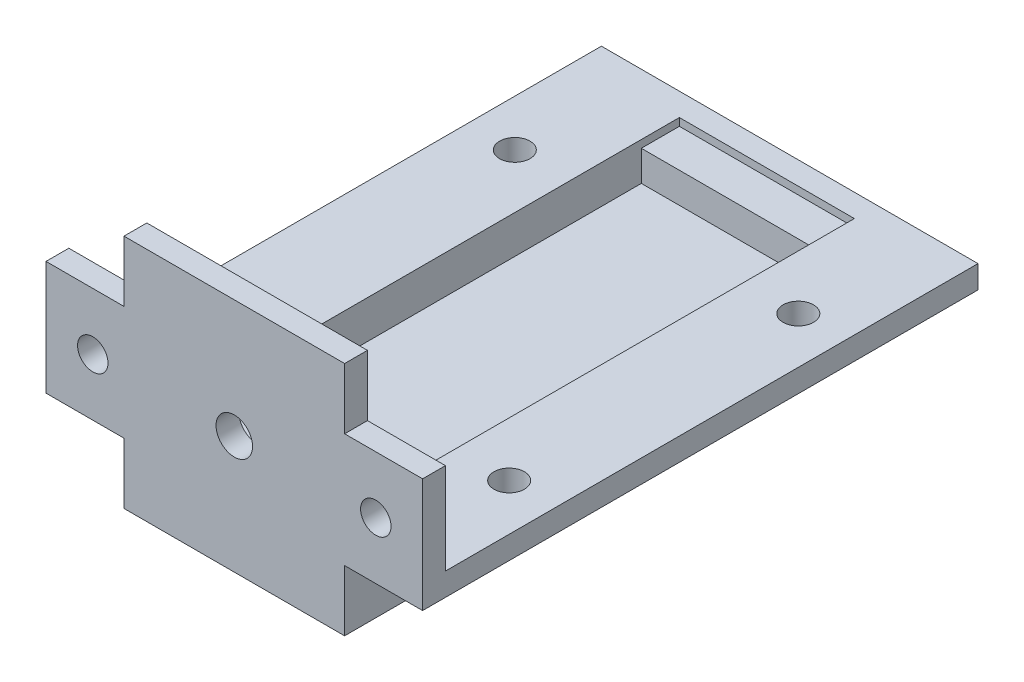
ISO-10303-21;
HEADER;
FILE_DESCRIPTION(('STEP AP214'),'2;1');
FILE_NAME('part.step','',(''),(''),'','','');
FILE_SCHEMA(('AUTOMOTIVE_DESIGN { 1 0 10303 214 1 1 1 1 }'));
ENDSEC;
DATA;
#1=APPLICATION_CONTEXT('core data for automotive mechanical design processes');
#2=APPLICATION_PROTOCOL_DEFINITION('international standard','automotive_design',2000,#1);
#3=PRODUCT_CONTEXT('',#1,'mechanical');
#4=PRODUCT('Part','Part','',(#3));
#5=PRODUCT_RELATED_PRODUCT_CATEGORY('part','',(#4));
#6=PRODUCT_DEFINITION_FORMATION('','',#4);
#7=PRODUCT_DEFINITION_CONTEXT('part definition',#1,'design');
#8=PRODUCT_DEFINITION('design','',#6,#7);
#9=PRODUCT_DEFINITION_SHAPE('','',#8);
#10=(LENGTH_UNIT() NAMED_UNIT(*) SI_UNIT(.MILLI.,.METRE.));
#11=(NAMED_UNIT(*) PLANE_ANGLE_UNIT() SI_UNIT($,.RADIAN.));
#12=(NAMED_UNIT(*) SI_UNIT($,.STERADIAN.) SOLID_ANGLE_UNIT());
#13=UNCERTAINTY_MEASURE_WITH_UNIT(LENGTH_MEASURE(1.E-05),#10,'distance_accuracy_value','');
#14=(GEOMETRIC_REPRESENTATION_CONTEXT(3) GLOBAL_UNCERTAINTY_ASSIGNED_CONTEXT((#13)) GLOBAL_UNIT_ASSIGNED_CONTEXT((#10,
#11,#12)) REPRESENTATION_CONTEXT('',''));
#15=CARTESIAN_POINT('',(0.,0.,0.));
#16=DIRECTION('',(0.,0.,1.));
#17=DIRECTION('',(1.,0.,0.));
#18=AXIS2_PLACEMENT_3D('',#15,#16,#17);
#19=CARTESIAN_POINT('',(-11.5,-9.00000000000001,0.));
#20=DIRECTION('',(-1.,0.,0.));
#21=DIRECTION('',(0.,-1.,0.));
#22=AXIS2_PLACEMENT_3D('',#19,#20,#21);
#23=PLANE('',#22);
#24=DIRECTION('',(0.,-1.,0.));
#25=VECTOR('',#24,1.);
#26=CARTESIAN_POINT('',(-11.5,-5.,-62.));
#27=LINE('',#26,#25);
#28=CARTESIAN_POINT('',(-11.5,-5.,-62.));
#29=VERTEX_POINT('',#28);
#30=CARTESIAN_POINT('',(-11.5,-9.00000000000001,-62.));
#31=VERTEX_POINT('',#30);
#32=EDGE_CURVE('E63',#29,#31,#27,.T.);
#33=ORIENTED_EDGE('',*,*,#32,.F.);
#34=DIRECTION('',(0.,0.,1.));
#35=VECTOR('',#34,1.);
#36=CARTESIAN_POINT('',(-11.5,-5.,-67.));
#37=LINE('',#36,#35);
#38=CARTESIAN_POINT('',(-11.5,-5.,-67.));
#39=VERTEX_POINT('',#38);
#40=EDGE_CURVE('E68',#39,#29,#37,.T.);
#41=ORIENTED_EDGE('',*,*,#40,.F.);
#42=DIRECTION('',(0.,1.,0.));
#43=VECTOR('',#42,1.);
#44=CARTESIAN_POINT('',(-11.5,-9.00000000000001,-67.));
#45=LINE('',#44,#43);
#46=CARTESIAN_POINT('',(-11.5,-4.,-67.));
#47=VERTEX_POINT('',#46);
#48=EDGE_CURVE('E252',#39,#47,#45,.T.);
#49=ORIENTED_EDGE('',*,*,#48,.T.);
#50=DIRECTION('',(0.,0.,1.));
#51=VECTOR('',#50,1.);
#52=CARTESIAN_POINT('',(-11.5,-4.,0.));
#53=LINE('',#52,#51);
#54=CARTESIAN_POINT('',(-11.5,-4.,0.));
#55=VERTEX_POINT('',#54);
#56=EDGE_CURVE('E242',#47,#55,#53,.T.);
#57=ORIENTED_EDGE('',*,*,#56,.T.);
#58=DIRECTION('',(0.,1.,0.));
#59=VECTOR('',#58,1.);
#60=CARTESIAN_POINT('',(-11.5,-9.00000000000001,0.));
#61=LINE('',#60,#59);
#62=CARTESIAN_POINT('',(-11.5,-9.00000000000001,0.));
#63=VERTEX_POINT('',#62);
#64=EDGE_CURVE('E194',#63,#55,#61,.T.);
#65=ORIENTED_EDGE('',*,*,#64,.F.);
#66=DIRECTION('',(0.,0.,1.));
#67=VECTOR('',#66,1.);
#68=CARTESIAN_POINT('',(-11.5,-9.00000000000001,0.));
#69=LINE('',#68,#67);
#70=EDGE_CURVE('E236',#31,#63,#69,.T.);
#71=ORIENTED_EDGE('',*,*,#70,.F.);
#72=EDGE_LOOP('',(#33,#41,#49,#57,#65,#71));
#73=FACE_BOUND('',#72,.T.);
#74=ADVANCED_FACE('F45',(#73),#23,.F.);
#75=CARTESIAN_POINT('',(11.5,-9.00000000000001,0.));
#76=DIRECTION('',(1.,0.,0.));
#77=DIRECTION('',(0.,1.,0.));
#78=AXIS2_PLACEMENT_3D('',#75,#76,#77);
#79=PLANE('',#78);
#80=DIRECTION('',(0.,-1.,0.));
#81=VECTOR('',#80,1.);
#82=CARTESIAN_POINT('',(11.5,-5.,-62.));
#83=LINE('',#82,#81);
#84=CARTESIAN_POINT('',(11.5,-5.,-62.));
#85=VERTEX_POINT('',#84);
#86=CARTESIAN_POINT('',(11.5,-9.00000000000001,-62.));
#87=VERTEX_POINT('',#86);
#88=EDGE_CURVE('E197',#85,#87,#83,.T.);
#89=ORIENTED_EDGE('',*,*,#88,.T.);
#90=DIRECTION('',(0.,0.,-1.));
#91=VECTOR('',#90,1.);
#92=CARTESIAN_POINT('',(11.5,-9.00000000000001,0.));
#93=LINE('',#92,#91);
#94=CARTESIAN_POINT('',(11.5,-9.00000000000001,0.));
#95=VERTEX_POINT('',#94);
#96=EDGE_CURVE('E185',#95,#87,#93,.T.);
#97=ORIENTED_EDGE('',*,*,#96,.F.);
#98=DIRECTION('',(0.,1.,0.));
#99=VECTOR('',#98,1.);
#100=CARTESIAN_POINT('',(11.5,-9.00000000000001,0.));
#101=LINE('',#100,#99);
#102=CARTESIAN_POINT('',(11.5,-4.00000000000001,0.));
#103=VERTEX_POINT('',#102);
#104=EDGE_CURVE('E259',#95,#103,#101,.T.);
#105=ORIENTED_EDGE('',*,*,#104,.T.);
#106=DIRECTION('',(0.,0.,-1.));
#107=VECTOR('',#106,1.);
#108=CARTESIAN_POINT('',(11.5,-4.00000000000001,0.));
#109=LINE('',#108,#107);
#110=CARTESIAN_POINT('',(11.5,-4.00000000000001,-67.));
#111=VERTEX_POINT('',#110);
#112=EDGE_CURVE('E245',#103,#111,#109,.T.);
#113=ORIENTED_EDGE('',*,*,#112,.T.);
#114=DIRECTION('',(0.,1.,0.));
#115=VECTOR('',#114,1.);
#116=CARTESIAN_POINT('',(11.5,-9.00000000000001,-67.));
#117=LINE('',#116,#115);
#118=CARTESIAN_POINT('',(11.5,-5.,-67.));
#119=VERTEX_POINT('',#118);
#120=EDGE_CURVE('E256',#119,#111,#117,.T.);
#121=ORIENTED_EDGE('',*,*,#120,.F.);
#122=DIRECTION('',(0.,0.,-1.));
#123=VECTOR('',#122,1.);
#124=CARTESIAN_POINT('',(11.5,-5.,-67.));
#125=LINE('',#124,#123);
#126=EDGE_CURVE('E201',#85,#119,#125,.T.);
#127=ORIENTED_EDGE('',*,*,#126,.F.);
#128=EDGE_LOOP('',(#89,#97,#105,#113,#121,#127));
#129=FACE_BOUND('',#128,.T.);
#130=ADVANCED_FACE('F198',(#129),#79,.F.);
#131=CARTESIAN_POINT('',(0.,-9.00000000000001,0.));
#132=DIRECTION('',(0.,-1.,0.));
#133=DIRECTION('',(1.,0.,0.));
#134=AXIS2_PLACEMENT_3D('',#131,#132,#133);
#135=PLANE('',#134);
#136=DIRECTION('',(1.,0.,0.));
#137=VECTOR('',#136,1.);
#138=CARTESIAN_POINT('',(-11.5,-9.00000000000001,-62.));
#139=LINE('',#138,#137);
#140=EDGE_CURVE('E189',#31,#87,#139,.T.);
#141=ORIENTED_EDGE('',*,*,#140,.F.);
#142=ORIENTED_EDGE('',*,*,#70,.T.);
#143=DIRECTION('',(1.,0.,0.));
#144=VECTOR('',#143,1.);
#145=CARTESIAN_POINT('',(-11.5,-9.00000000000001,0.));
#146=LINE('',#145,#144);
#147=EDGE_CURVE('E191',#63,#95,#146,.T.);
#148=ORIENTED_EDGE('',*,*,#147,.T.);
#149=ORIENTED_EDGE('',*,*,#96,.T.);
#150=EDGE_LOOP('',(#141,#142,#148,#149));
#151=FACE_BOUND('',#150,.T.);
#152=ADVANCED_FACE('F187',(#151),#135,.F.);
#153=CARTESIAN_POINT('',(-14.5,16.,3.));
#154=DIRECTION('',(1.,0.,0.));
#155=DIRECTION('',(0.,1.,0.));
#156=AXIS2_PLACEMENT_3D('',#153,#154,#155);
#157=PLANE('',#156);
#158=DIRECTION('',(0.,-1.,0.));
#159=VECTOR('',#158,1.);
#160=CARTESIAN_POINT('',(-14.5,16.,0.));
#161=LINE('',#160,#159);
#162=CARTESIAN_POINT('',(-14.5,16.,0.));
#163=VERTEX_POINT('',#162);
#164=CARTESIAN_POINT('',(-14.5,8.,0.));
#165=VERTEX_POINT('',#164);
#166=EDGE_CURVE('E308',#163,#165,#161,.T.);
#167=ORIENTED_EDGE('',*,*,#166,.T.);
#168=DIRECTION('',(0.,0.,-1.));
#169=VECTOR('',#168,1.);
#170=CARTESIAN_POINT('',(-14.5,8.,3.));
#171=LINE('',#170,#169);
#172=CARTESIAN_POINT('',(-14.5,8.,3.));
#173=VERTEX_POINT('',#172);
#174=EDGE_CURVE('E11',#173,#165,#171,.T.);
#175=ORIENTED_EDGE('',*,*,#174,.F.);
#176=DIRECTION('',(0.,-1.,0.));
#177=VECTOR('',#176,1.);
#178=CARTESIAN_POINT('',(-14.5,16.,3.));
#179=LINE('',#178,#177);
#180=CARTESIAN_POINT('',(-14.5,16.,3.));
#181=VERTEX_POINT('',#180);
#182=EDGE_CURVE('E309',#181,#173,#179,.T.);
#183=ORIENTED_EDGE('',*,*,#182,.F.);
#184=DIRECTION('',(0.,0.,-1.));
#185=VECTOR('',#184,1.);
#186=CARTESIAN_POINT('',(-14.5,16.,3.));
#187=LINE('',#186,#185);
#188=EDGE_CURVE('E347',#181,#163,#187,.T.);
#189=ORIENTED_EDGE('',*,*,#188,.T.);
#190=EDGE_LOOP('',(#167,#175,#183,#189));
#191=FACE_BOUND('',#190,.T.);
#192=ADVANCED_FACE('F47',(#191),#157,.F.);
#193=CARTESIAN_POINT('',(-14.5,8.,3.));
#194=DIRECTION('',(0.,-1.,0.));
#195=DIRECTION('',(1.,0.,0.));
#196=AXIS2_PLACEMENT_3D('',#193,#194,#195);
#197=PLANE('',#196);
#198=DIRECTION('',(-1.,0.,0.));
#199=VECTOR('',#198,1.);
#200=CARTESIAN_POINT('',(-14.5,8.,0.));
#201=LINE('',#200,#199);
#202=CARTESIAN_POINT('',(-24.75,7.99999999999999,0.));
#203=VERTEX_POINT('',#202);
#204=EDGE_CURVE('E351',#165,#203,#201,.T.);
#205=ORIENTED_EDGE('',*,*,#204,.T.);
#206=DIRECTION('',(0.,0.,-1.));
#207=VECTOR('',#206,1.);
#208=CARTESIAN_POINT('',(-24.75,7.99999999999999,3.));
#209=LINE('',#208,#207);
#210=CARTESIAN_POINT('',(-24.75,7.99999999999999,3.));
#211=VERTEX_POINT('',#210);
#212=EDGE_CURVE('E55',#211,#203,#209,.T.);
#213=ORIENTED_EDGE('',*,*,#212,.F.);
#214=DIRECTION('',(-1.,0.,0.));
#215=VECTOR('',#214,1.);
#216=CARTESIAN_POINT('',(-14.5,8.,3.));
#217=LINE('',#216,#215);
#218=EDGE_CURVE('E313',#173,#211,#217,.T.);
#219=ORIENTED_EDGE('',*,*,#218,.F.);
#220=ORIENTED_EDGE('',*,*,#174,.T.);
#221=EDGE_LOOP('',(#205,#213,#219,#220));
#222=FACE_BOUND('',#221,.T.);
#223=ADVANCED_FACE('F455',(#222),#197,.F.);
#224=CARTESIAN_POINT('',(-24.75,7.99999999999999,3.));
#225=DIRECTION('',(1.,0.,0.));
#226=DIRECTION('',(0.,1.,0.));
#227=AXIS2_PLACEMENT_3D('',#224,#225,#226);
#228=PLANE('',#227);
#229=DIRECTION('',(0.,-1.,0.));
#230=VECTOR('',#229,1.);
#231=CARTESIAN_POINT('',(-24.75,7.99999999999999,0.));
#232=LINE('',#231,#230);
#233=CARTESIAN_POINT('',(-24.75,-4.,0.));
#234=VERTEX_POINT('',#233);
#235=EDGE_CURVE('E354',#203,#234,#232,.T.);
#236=ORIENTED_EDGE('',*,*,#235,.T.);
#237=DIRECTION('',(0.,0.,1.));
#238=VECTOR('',#237,1.);
#239=CARTESIAN_POINT('',(-24.75,-4.,-70.));
#240=LINE('',#239,#238);
#241=CARTESIAN_POINT('',(-24.75,-4.,-70.));
#242=VERTEX_POINT('',#241);
#243=EDGE_CURVE('E297',#242,#234,#240,.T.);
#244=ORIENTED_EDGE('',*,*,#243,.F.);
#245=DIRECTION('',(0.,1.,0.));
#246=VECTOR('',#245,1.);
#247=CARTESIAN_POINT('',(-24.75,-7.00000000000001,-70.));
#248=LINE('',#247,#246);
#249=CARTESIAN_POINT('',(-24.75,-7.00000000000001,-70.));
#250=VERTEX_POINT('',#249);
#251=EDGE_CURVE('E294',#250,#242,#248,.T.);
#252=ORIENTED_EDGE('',*,*,#251,.F.);
#253=DIRECTION('',(0.,0.,-1.));
#254=VECTOR('',#253,1.);
#255=CARTESIAN_POINT('',(-24.75,-7.,3.));
#256=LINE('',#255,#254);
#257=CARTESIAN_POINT('',(-24.75,-7.,3.));
#258=VERTEX_POINT('',#257);
#259=EDGE_CURVE('E399',#258,#250,#256,.T.);
#260=ORIENTED_EDGE('',*,*,#259,.F.);
#261=DIRECTION('',(0.,-1.,0.));
#262=VECTOR('',#261,1.);
#263=CARTESIAN_POINT('',(-24.75,7.99999999999999,3.));
#264=LINE('',#263,#262);
#265=EDGE_CURVE('E317',#211,#258,#264,.T.);
#266=ORIENTED_EDGE('',*,*,#265,.F.);
#267=ORIENTED_EDGE('',*,*,#212,.T.);
#268=EDGE_LOOP('',(#236,#244,#252,#260,#266,#267));
#269=FACE_BOUND('',#268,.T.);
#270=ADVANCED_FACE('F434',(#269),#228,.F.);
#271=CARTESIAN_POINT('',(-24.75,-7.,3.));
#272=DIRECTION('',(0.,1.,0.));
#273=DIRECTION('',(0.,0.,1.));
#274=AXIS2_PLACEMENT_3D('',#271,#272,#273);
#275=PLANE('',#274);
#276=CARTESIAN_POINT('',(-18.63,-7.,-14.5));
#277=DIRECTION('',(0.,1.,0.));
#278=DIRECTION('',(0.,0.,1.));
#279=AXIS2_PLACEMENT_3D('',#276,#277,#278);
#280=CIRCLE('',#279,2.00000000000001);
#281=CARTESIAN_POINT('',(-18.63,-7.,-12.5));
#282=VERTEX_POINT('',#281);
#283=EDGE_CURVE('E680',#282,#282,#280,.T.);
#284=ORIENTED_EDGE('',*,*,#283,.T.);
#285=EDGE_LOOP('',(#284));
#286=FACE_BOUND('',#285,.T.);
#287=CARTESIAN_POINT('',(-18.63,-7.,-52.5));
#288=DIRECTION('',(0.,1.,0.));
#289=DIRECTION('',(0.,0.,1.));
#290=AXIS2_PLACEMENT_3D('',#287,#288,#289);
#291=CIRCLE('',#290,2.);
#292=CARTESIAN_POINT('',(-18.63,-7.,-50.5));
#293=VERTEX_POINT('',#292);
#294=EDGE_CURVE('E684',#293,#293,#291,.T.);
#295=ORIENTED_EDGE('',*,*,#294,.T.);
#296=EDGE_LOOP('',(#295));
#297=FACE_BOUND('',#296,.T.);
#298=ORIENTED_EDGE('',*,*,#259,.T.);
#299=DIRECTION('',(-1.,0.,0.));
#300=VECTOR('',#299,1.);
#301=CARTESIAN_POINT('',(-14.5,-7.00000000000001,-70.));
#302=LINE('',#301,#300);
#303=CARTESIAN_POINT('',(-14.5,-7.00000000000001,-70.));
#304=VERTEX_POINT('',#303);
#305=EDGE_CURVE('E290',#304,#250,#302,.T.);
#306=ORIENTED_EDGE('',*,*,#305,.F.);
#307=DIRECTION('',(0.,0.,-1.));
#308=VECTOR('',#307,1.);
#309=CARTESIAN_POINT('',(-14.5,-7.,3.));
#310=LINE('',#309,#308);
#311=CARTESIAN_POINT('',(-14.5,-7.,3.));
#312=VERTEX_POINT('',#311);
#313=EDGE_CURVE('E396',#312,#304,#310,.T.);
#314=ORIENTED_EDGE('',*,*,#313,.F.);
#315=DIRECTION('',(1.,0.,0.));
#316=VECTOR('',#315,1.);
#317=CARTESIAN_POINT('',(-24.75,-7.,3.));
#318=LINE('',#317,#316);
#319=EDGE_CURVE('E320',#258,#312,#318,.T.);
#320=ORIENTED_EDGE('',*,*,#319,.F.);
#321=EDGE_LOOP('',(#298,#306,#314,#320));
#322=FACE_BOUND('',#321,.T.);
#323=ADVANCED_FACE('F448',(#286,#297,#322),#275,.F.);
#324=CARTESIAN_POINT('',(-14.5,-7.,3.));
#325=DIRECTION('',(1.,0.,0.));
#326=DIRECTION('',(0.,1.,0.));
#327=AXIS2_PLACEMENT_3D('',#324,#325,#326);
#328=PLANE('',#327);
#329=ORIENTED_EDGE('',*,*,#313,.T.);
#330=DIRECTION('',(0.,1.,0.));
#331=VECTOR('',#330,1.);
#332=CARTESIAN_POINT('',(-14.5,-15.,-70.));
#333=LINE('',#332,#331);
#334=CARTESIAN_POINT('',(-14.5,-15.,-70.));
#335=VERTEX_POINT('',#334);
#336=EDGE_CURVE('E286',#335,#304,#333,.T.);
#337=ORIENTED_EDGE('',*,*,#336,.F.);
#338=DIRECTION('',(0.,0.,-1.));
#339=VECTOR('',#338,1.);
#340=CARTESIAN_POINT('',(-14.5,-15.,3.));
#341=LINE('',#340,#339);
#342=CARTESIAN_POINT('',(-14.5,-15.,3.));
#343=VERTEX_POINT('',#342);
#344=EDGE_CURVE('E393',#343,#335,#341,.T.);
#345=ORIENTED_EDGE('',*,*,#344,.F.);
#346=DIRECTION('',(0.,-1.,0.));
#347=VECTOR('',#346,1.);
#348=CARTESIAN_POINT('',(-14.5,-7.,3.));
#349=LINE('',#348,#347);
#350=EDGE_CURVE('E323',#312,#343,#349,.T.);
#351=ORIENTED_EDGE('',*,*,#350,.F.);
#352=EDGE_LOOP('',(#329,#337,#345,#351));
#353=FACE_BOUND('',#352,.T.);
#354=ADVANCED_FACE('F495',(#353),#328,.F.);
#355=CARTESIAN_POINT('',(-14.5,-15.,3.));
#356=DIRECTION('',(0.,1.,0.));
#357=DIRECTION('',(0.,0.,1.));
#358=AXIS2_PLACEMENT_3D('',#355,#356,#357);
#359=PLANE('',#358);
#360=ORIENTED_EDGE('',*,*,#344,.T.);
#361=DIRECTION('',(-1.,0.,0.));
#362=VECTOR('',#361,1.);
#363=CARTESIAN_POINT('',(14.5,-15.,-70.));
#364=LINE('',#363,#362);
#365=CARTESIAN_POINT('',(14.5,-15.,-70.));
#366=VERTEX_POINT('',#365);
#367=EDGE_CURVE('E282',#366,#335,#364,.T.);
#368=ORIENTED_EDGE('',*,*,#367,.F.);
#369=DIRECTION('',(0.,0.,-1.));
#370=VECTOR('',#369,1.);
#371=CARTESIAN_POINT('',(14.5,-15.,3.));
#372=LINE('',#371,#370);
#373=CARTESIAN_POINT('',(14.5,-15.,3.));
#374=VERTEX_POINT('',#373);
#375=EDGE_CURVE('E390',#374,#366,#372,.T.);
#376=ORIENTED_EDGE('',*,*,#375,.F.);
#377=DIRECTION('',(1.,0.,0.));
#378=VECTOR('',#377,1.);
#379=CARTESIAN_POINT('',(-14.5,-15.,3.));
#380=LINE('',#379,#378);
#381=EDGE_CURVE('E326',#343,#374,#380,.T.);
#382=ORIENTED_EDGE('',*,*,#381,.F.);
#383=EDGE_LOOP('',(#360,#368,#376,#382));
#384=FACE_BOUND('',#383,.T.);
#385=ADVANCED_FACE('F492',(#384),#359,.F.);
#386=CARTESIAN_POINT('',(14.5,-7.00000000000001,3.));
#387=DIRECTION('',(-1.,0.,0.));
#388=DIRECTION('',(0.,0.,1.));
#389=AXIS2_PLACEMENT_3D('',#386,#387,#388);
#390=PLANE('',#389);
#391=ORIENTED_EDGE('',*,*,#375,.T.);
#392=DIRECTION('',(0.,-1.,0.));
#393=VECTOR('',#392,1.);
#394=CARTESIAN_POINT('',(14.5,-7.00000000000001,-70.));
#395=LINE('',#394,#393);
#396=CARTESIAN_POINT('',(14.5,-7.00000000000001,-70.));
#397=VERTEX_POINT('',#396);
#398=EDGE_CURVE('E278',#397,#366,#395,.T.);
#399=ORIENTED_EDGE('',*,*,#398,.F.);
#400=DIRECTION('',(0.,0.,-1.));
#401=VECTOR('',#400,1.);
#402=CARTESIAN_POINT('',(14.5,-7.00000000000001,3.));
#403=LINE('',#402,#401);
#404=CARTESIAN_POINT('',(14.5,-7.00000000000001,3.));
#405=VERTEX_POINT('',#404);
#406=EDGE_CURVE('E387',#405,#397,#403,.T.);
#407=ORIENTED_EDGE('',*,*,#406,.F.);
#408=DIRECTION('',(0.,1.,0.));
#409=VECTOR('',#408,1.);
#410=CARTESIAN_POINT('',(14.5,-7.00000000000001,3.));
#411=LINE('',#410,#409);
#412=EDGE_CURVE('E329',#374,#405,#411,.T.);
#413=ORIENTED_EDGE('',*,*,#412,.F.);
#414=EDGE_LOOP('',(#391,#399,#407,#413));
#415=FACE_BOUND('',#414,.T.);
#416=ADVANCED_FACE('F487',(#415),#390,.F.);
#417=CARTESIAN_POINT('',(24.75,-7.,3.));
#418=DIRECTION('',(0.,1.,0.));
#419=DIRECTION('',(-1.,0.,0.));
#420=AXIS2_PLACEMENT_3D('',#417,#418,#419);
#421=PLANE('',#420);
#422=CARTESIAN_POINT('',(18.63,-7.00000000000001,-52.5));
#423=DIRECTION('',(0.,1.,0.));
#424=DIRECTION('',(-1.,0.,0.));
#425=AXIS2_PLACEMENT_3D('',#422,#423,#424);
#426=CIRCLE('',#425,2.);
#427=CARTESIAN_POINT('',(16.63,-7.00000000000001,-52.5));
#428=VERTEX_POINT('',#427);
#429=EDGE_CURVE('E209',#428,#428,#426,.T.);
#430=ORIENTED_EDGE('',*,*,#429,.T.);
#431=EDGE_LOOP('',(#430));
#432=FACE_BOUND('',#431,.T.);
#433=CARTESIAN_POINT('',(18.63,-7.00000000000001,-14.5));
#434=DIRECTION('',(0.,1.,0.));
#435=DIRECTION('',(-1.,0.,0.));
#436=AXIS2_PLACEMENT_3D('',#433,#434,#435);
#437=CIRCLE('',#436,2.00000000000001);
#438=CARTESIAN_POINT('',(16.63,-7.00000000000001,-14.5));
#439=VERTEX_POINT('',#438);
#440=EDGE_CURVE('E216',#439,#439,#437,.T.);
#441=ORIENTED_EDGE('',*,*,#440,.T.);
#442=EDGE_LOOP('',(#441));
#443=FACE_BOUND('',#442,.T.);
#444=ORIENTED_EDGE('',*,*,#406,.T.);
#445=DIRECTION('',(-1.,0.,0.));
#446=VECTOR('',#445,1.);
#447=CARTESIAN_POINT('',(24.75,-7.00000000000001,-70.));
#448=LINE('',#447,#446);
#449=CARTESIAN_POINT('',(24.75,-7.00000000000001,-70.));
#450=VERTEX_POINT('',#449);
#451=EDGE_CURVE('E274',#450,#397,#448,.T.);
#452=ORIENTED_EDGE('',*,*,#451,.F.);
#453=DIRECTION('',(0.,0.,-1.));
#454=VECTOR('',#453,1.);
#455=CARTESIAN_POINT('',(24.75,-7.,3.));
#456=LINE('',#455,#454);
#457=CARTESIAN_POINT('',(24.75,-7.,3.));
#458=VERTEX_POINT('',#457);
#459=EDGE_CURVE('E384',#458,#450,#456,.T.);
#460=ORIENTED_EDGE('',*,*,#459,.F.);
#461=DIRECTION('',(1.,0.,0.));
#462=VECTOR('',#461,1.);
#463=CARTESIAN_POINT('',(24.75,-7.,3.));
#464=LINE('',#463,#462);
#465=EDGE_CURVE('E332',#405,#458,#464,.T.);
#466=ORIENTED_EDGE('',*,*,#465,.F.);
#467=EDGE_LOOP('',(#444,#452,#460,#466));
#468=FACE_BOUND('',#467,.T.);
#469=ADVANCED_FACE('F482',(#432,#443,#468),#421,.F.);
#470=CARTESIAN_POINT('',(24.75,8.,3.));
#471=DIRECTION('',(-1.,0.,0.));
#472=DIRECTION('',(0.,-1.,0.));
#473=AXIS2_PLACEMENT_3D('',#470,#471,#472);
#474=PLANE('',#473);
#475=ORIENTED_EDGE('',*,*,#459,.T.);
#476=DIRECTION('',(0.,-1.,0.));
#477=VECTOR('',#476,1.);
#478=CARTESIAN_POINT('',(24.75,-4.00000000000001,-70.));
#479=LINE('',#478,#477);
#480=CARTESIAN_POINT('',(24.75,-4.00000000000001,-70.));
#481=VERTEX_POINT('',#480);
#482=EDGE_CURVE('E269',#481,#450,#479,.T.);
#483=ORIENTED_EDGE('',*,*,#482,.F.);
#484=DIRECTION('',(0.,0.,1.));
#485=VECTOR('',#484,1.);
#486=CARTESIAN_POINT('',(24.75,-4.00000000000001,-70.));
#487=LINE('',#486,#485);
#488=CARTESIAN_POINT('',(24.75,-4.00000000000001,0.));
#489=VERTEX_POINT('',#488);
#490=EDGE_CURVE('E304',#481,#489,#487,.T.);
#491=ORIENTED_EDGE('',*,*,#490,.T.);
#492=DIRECTION('',(0.,1.,0.));
#493=VECTOR('',#492,1.);
#494=CARTESIAN_POINT('',(24.75,8.,0.));
#495=LINE('',#494,#493);
#496=CARTESIAN_POINT('',(24.75,8.,0.));
#497=VERTEX_POINT('',#496);
#498=EDGE_CURVE('E358',#489,#497,#495,.T.);
#499=ORIENTED_EDGE('',*,*,#498,.T.);
#500=DIRECTION('',(0.,0.,-1.));
#501=VECTOR('',#500,1.);
#502=CARTESIAN_POINT('',(24.75,8.,3.));
#503=LINE('',#502,#501);
#504=CARTESIAN_POINT('',(24.75,8.,3.));
#505=VERTEX_POINT('',#504);
#506=EDGE_CURVE('E380',#505,#497,#503,.T.);
#507=ORIENTED_EDGE('',*,*,#506,.F.);
#508=DIRECTION('',(0.,1.,0.));
#509=VECTOR('',#508,1.);
#510=CARTESIAN_POINT('',(24.75,8.,3.));
#511=LINE('',#510,#509);
#512=EDGE_CURVE('E335',#458,#505,#511,.T.);
#513=ORIENTED_EDGE('',*,*,#512,.F.);
#514=EDGE_LOOP('',(#475,#483,#491,#499,#507,#513));
#515=FACE_BOUND('',#514,.T.);
#516=ADVANCED_FACE('F478',(#515),#474,.F.);
#517=CARTESIAN_POINT('',(14.5,8.,3.));
#518=DIRECTION('',(0.,-1.,0.));
#519=DIRECTION('',(1.,0.,0.));
#520=AXIS2_PLACEMENT_3D('',#517,#518,#519);
#521=PLANE('',#520);
#522=DIRECTION('',(-1.,0.,0.));
#523=VECTOR('',#522,1.);
#524=CARTESIAN_POINT('',(14.5,8.,0.));
#525=LINE('',#524,#523);
#526=CARTESIAN_POINT('',(14.5,8.,0.));
#527=VERTEX_POINT('',#526);
#528=EDGE_CURVE('E361',#497,#527,#525,.T.);
#529=ORIENTED_EDGE('',*,*,#528,.T.);
#530=DIRECTION('',(0.,0.,-1.));
#531=VECTOR('',#530,1.);
#532=CARTESIAN_POINT('',(14.5,8.,3.));
#533=LINE('',#532,#531);
#534=CARTESIAN_POINT('',(14.5,8.,3.));
#535=VERTEX_POINT('',#534);
#536=EDGE_CURVE('E376',#535,#527,#533,.T.);
#537=ORIENTED_EDGE('',*,*,#536,.F.);
#538=DIRECTION('',(-1.,0.,0.));
#539=VECTOR('',#538,1.);
#540=CARTESIAN_POINT('',(14.5,8.,3.));
#541=LINE('',#540,#539);
#542=EDGE_CURVE('E338',#505,#535,#541,.T.);
#543=ORIENTED_EDGE('',*,*,#542,.F.);
#544=ORIENTED_EDGE('',*,*,#506,.T.);
#545=EDGE_LOOP('',(#529,#537,#543,#544));
#546=FACE_BOUND('',#545,.T.);
#547=ADVANCED_FACE('F473',(#546),#521,.F.);
#548=CARTESIAN_POINT('',(14.5,16.,3.));
#549=DIRECTION('',(-1.,0.,0.));
#550=DIRECTION('',(0.,-1.,0.));
#551=AXIS2_PLACEMENT_3D('',#548,#549,#550);
#552=PLANE('',#551);
#553=DIRECTION('',(0.,1.,0.));
#554=VECTOR('',#553,1.);
#555=CARTESIAN_POINT('',(14.5,16.,0.));
#556=LINE('',#555,#554);
#557=CARTESIAN_POINT('',(14.5,16.,0.));
#558=VERTEX_POINT('',#557);
#559=EDGE_CURVE('E364',#527,#558,#556,.T.);
#560=ORIENTED_EDGE('',*,*,#559,.T.);
#561=DIRECTION('',(0.,0.,-1.));
#562=VECTOR('',#561,1.);
#563=CARTESIAN_POINT('',(14.5,16.,3.));
#564=LINE('',#563,#562);
#565=CARTESIAN_POINT('',(14.5,16.,3.));
#566=VERTEX_POINT('',#565);
#567=EDGE_CURVE('E372',#566,#558,#564,.T.);
#568=ORIENTED_EDGE('',*,*,#567,.F.);
#569=DIRECTION('',(0.,1.,0.));
#570=VECTOR('',#569,1.);
#571=CARTESIAN_POINT('',(14.5,16.,3.));
#572=LINE('',#571,#570);
#573=EDGE_CURVE('E341',#535,#566,#572,.T.);
#574=ORIENTED_EDGE('',*,*,#573,.F.);
#575=ORIENTED_EDGE('',*,*,#536,.T.);
#576=EDGE_LOOP('',(#560,#568,#574,#575));
#577=FACE_BOUND('',#576,.T.);
#578=ADVANCED_FACE('F467',(#577),#552,.F.);
#579=CARTESIAN_POINT('',(14.5,16.,3.));
#580=DIRECTION('',(0.,-1.,0.));
#581=DIRECTION('',(1.,0.,0.));
#582=AXIS2_PLACEMENT_3D('',#579,#580,#581);
#583=PLANE('',#582);
#584=DIRECTION('',(-1.,0.,0.));
#585=VECTOR('',#584,1.);
#586=CARTESIAN_POINT('',(14.5,16.,0.));
#587=LINE('',#586,#585);
#588=EDGE_CURVE('E314',#558,#163,#587,.T.);
#589=ORIENTED_EDGE('',*,*,#588,.T.);
#590=ORIENTED_EDGE('',*,*,#188,.F.);
#591=DIRECTION('',(-1.,0.,0.));
#592=VECTOR('',#591,1.);
#593=CARTESIAN_POINT('',(14.5,16.,3.));
#594=LINE('',#593,#592);
#595=EDGE_CURVE('E344',#566,#181,#594,.T.);
#596=ORIENTED_EDGE('',*,*,#595,.F.);
#597=ORIENTED_EDGE('',*,*,#567,.T.);
#598=EDGE_LOOP('',(#589,#590,#596,#597));
#599=FACE_BOUND('',#598,.T.);
#600=ADVANCED_FACE('F463',(#599),#583,.F.);
#601=CARTESIAN_POINT('',(0.,0.,3.));
#602=DIRECTION('',(0.,0.,-1.));
#603=DIRECTION('',(-1.,0.,0.));
#604=AXIS2_PLACEMENT_3D('',#601,#602,#603);
#605=PLANE('',#604);
#606=CARTESIAN_POINT('',(18.6,0.499999999999997,3.));
#607=DIRECTION('',(0.,0.,1.));
#608=DIRECTION('',(-1.,0.,0.));
#609=AXIS2_PLACEMENT_3D('',#606,#607,#608);
#610=CIRCLE('',#609,2.);
#611=CARTESIAN_POINT('',(16.6,0.499999999999997,3.));
#612=VERTEX_POINT('',#611);
#613=EDGE_CURVE('E223',#612,#612,#610,.T.);
#614=ORIENTED_EDGE('',*,*,#613,.F.);
#615=EDGE_LOOP('',(#614));
#616=FACE_BOUND('',#615,.T.);
#617=CARTESIAN_POINT('',(-18.6,0.499999999999997,3.));
#618=DIRECTION('',(0.,0.,1.));
#619=DIRECTION('',(1.,0.,0.));
#620=AXIS2_PLACEMENT_3D('',#617,#618,#619);
#621=CIRCLE('',#620,2.);
#622=CARTESIAN_POINT('',(-16.6,0.499999999999997,3.));
#623=VERTEX_POINT('',#622);
#624=EDGE_CURVE('E224',#623,#623,#621,.T.);
#625=ORIENTED_EDGE('',*,*,#624,.F.);
#626=EDGE_LOOP('',(#625));
#627=FACE_BOUND('',#626,.T.);
#628=CARTESIAN_POINT('',(0.,0.499999999999997,3.));
#629=DIRECTION('',(0.,0.,1.));
#630=DIRECTION('',(1.,0.,0.));
#631=AXIS2_PLACEMENT_3D('',#628,#629,#630);
#632=CIRCLE('',#631,2.4);
#633=CARTESIAN_POINT('',(2.4,0.499999999999997,3.));
#634=VERTEX_POINT('',#633);
#635=EDGE_CURVE('E228',#634,#634,#632,.T.);
#636=ORIENTED_EDGE('',*,*,#635,.F.);
#637=EDGE_LOOP('',(#636));
#638=FACE_BOUND('',#637,.T.);
#639=ORIENTED_EDGE('',*,*,#182,.T.);
#640=ORIENTED_EDGE('',*,*,#218,.T.);
#641=ORIENTED_EDGE('',*,*,#265,.T.);
#642=ORIENTED_EDGE('',*,*,#319,.T.);
#643=ORIENTED_EDGE('',*,*,#350,.T.);
#644=ORIENTED_EDGE('',*,*,#381,.T.);
#645=ORIENTED_EDGE('',*,*,#412,.T.);
#646=ORIENTED_EDGE('',*,*,#465,.T.);
#647=ORIENTED_EDGE('',*,*,#512,.T.);
#648=ORIENTED_EDGE('',*,*,#542,.T.);
#649=ORIENTED_EDGE('',*,*,#573,.T.);
#650=ORIENTED_EDGE('',*,*,#595,.T.);
#651=EDGE_LOOP('',(#639,#640,#641,#642,#643,#644,#645,#646,#647,#648,#649,#650));
#652=FACE_BOUND('',#651,.T.);
#653=ADVANCED_FACE('F423',(#616,#627,#638,#652),#605,.F.);
#654=CARTESIAN_POINT('',(0.,0.,0.));
#655=DIRECTION('',(0.,0.,-1.));
#656=DIRECTION('',(-1.,0.,0.));
#657=AXIS2_PLACEMENT_3D('',#654,#655,#656);
#658=PLANE('',#657);
#659=CARTESIAN_POINT('',(18.6,0.499999999999997,0.));
#660=DIRECTION('',(0.,0.,-1.));
#661=DIRECTION('',(-1.,0.,0.));
#662=AXIS2_PLACEMENT_3D('',#659,#660,#661);
#663=CIRCLE('',#662,2.);
#664=CARTESIAN_POINT('',(16.6,0.499999999999997,0.));
#665=VERTEX_POINT('',#664);
#666=EDGE_CURVE('E49',#665,#665,#663,.T.);
#667=ORIENTED_EDGE('',*,*,#666,.F.);
#668=EDGE_LOOP('',(#667));
#669=FACE_BOUND('',#668,.T.);
#670=CARTESIAN_POINT('',(-18.6,0.499999999999997,0.));
#671=DIRECTION('',(0.,0.,-1.));
#672=DIRECTION('',(-1.,0.,0.));
#673=AXIS2_PLACEMENT_3D('',#670,#671,#672);
#674=CIRCLE('',#673,2.);
#675=CARTESIAN_POINT('',(-20.6,0.499999999999997,0.));
#676=VERTEX_POINT('',#675);
#677=EDGE_CURVE('E407',#676,#676,#674,.T.);
#678=ORIENTED_EDGE('',*,*,#677,.F.);
#679=EDGE_LOOP('',(#678));
#680=FACE_BOUND('',#679,.T.);
#681=CARTESIAN_POINT('',(0.,0.499999999999997,0.));
#682=DIRECTION('',(0.,0.,-1.));
#683=DIRECTION('',(-1.,0.,0.));
#684=AXIS2_PLACEMENT_3D('',#681,#682,#683);
#685=CIRCLE('',#684,2.4);
#686=CARTESIAN_POINT('',(-2.4,0.499999999999997,0.));
#687=VERTEX_POINT('',#686);
#688=EDGE_CURVE('E235',#687,#687,#685,.T.);
#689=ORIENTED_EDGE('',*,*,#688,.F.);
#690=EDGE_LOOP('',(#689));
#691=FACE_BOUND('',#690,.T.);
#692=DIRECTION('',(1.,0.,0.));
#693=VECTOR('',#692,1.);
#694=CARTESIAN_POINT('',(-24.75,-4.,0.));
#695=LINE('',#694,#693);
#696=EDGE_CURVE('E270',#234,#55,#695,.T.);
#697=ORIENTED_EDGE('',*,*,#696,.F.);
#698=ORIENTED_EDGE('',*,*,#235,.F.);
#699=ORIENTED_EDGE('',*,*,#204,.F.);
#700=ORIENTED_EDGE('',*,*,#166,.F.);
#701=ORIENTED_EDGE('',*,*,#588,.F.);
#702=ORIENTED_EDGE('',*,*,#559,.F.);
#703=ORIENTED_EDGE('',*,*,#528,.F.);
#704=ORIENTED_EDGE('',*,*,#498,.F.);
#705=EDGE_CURVE('E255',#103,#489,#695,.T.);
#706=ORIENTED_EDGE('',*,*,#705,.F.);
#707=ORIENTED_EDGE('',*,*,#104,.F.);
#708=ORIENTED_EDGE('',*,*,#147,.F.);
#709=ORIENTED_EDGE('',*,*,#64,.T.);
#710=EDGE_LOOP('',(#697,#698,#699,#700,#701,#702,#703,#704,#706,#707,#708,#709));
#711=FACE_BOUND('',#710,.T.);
#712=ADVANCED_FACE('F419',(#669,#680,#691,#711),#658,.T.);
#713=CARTESIAN_POINT('',(-24.75,-4.,-70.));
#714=DIRECTION('',(0.,-1.,0.));
#715=DIRECTION('',(1.,0.,0.));
#716=AXIS2_PLACEMENT_3D('',#713,#714,#715);
#717=PLANE('',#716);
#718=CARTESIAN_POINT('',(18.63,-4.00000000000001,-52.5));
#719=DIRECTION('',(0.,1.,0.));
#720=DIRECTION('',(1.,0.,0.));
#721=AXIS2_PLACEMENT_3D('',#718,#719,#720);
#722=CIRCLE('',#721,2.);
#723=CARTESIAN_POINT('',(20.63,-4.00000000000001,-52.5));
#724=VERTEX_POINT('',#723);
#725=EDGE_CURVE('E693',#724,#724,#722,.T.);
#726=ORIENTED_EDGE('',*,*,#725,.F.);
#727=EDGE_LOOP('',(#726));
#728=FACE_BOUND('',#727,.T.);
#729=CARTESIAN_POINT('',(18.63,-4.00000000000001,-14.5));
#730=DIRECTION('',(0.,1.,0.));
#731=DIRECTION('',(-1.,0.,0.));
#732=AXIS2_PLACEMENT_3D('',#729,#730,#731);
#733=CIRCLE('',#732,2.00000000000001);
#734=CARTESIAN_POINT('',(16.63,-4.00000000000001,-14.5));
#735=VERTEX_POINT('',#734);
#736=EDGE_CURVE('E696',#735,#735,#733,.T.);
#737=ORIENTED_EDGE('',*,*,#736,.F.);
#738=EDGE_LOOP('',(#737));
#739=FACE_BOUND('',#738,.T.);
#740=CARTESIAN_POINT('',(-18.63,-4.,-14.5));
#741=DIRECTION('',(0.,1.,0.));
#742=DIRECTION('',(1.,0.,0.));
#743=AXIS2_PLACEMENT_3D('',#740,#741,#742);
#744=CIRCLE('',#743,2.00000000000001);
#745=CARTESIAN_POINT('',(-16.63,-4.,-14.5));
#746=VERTEX_POINT('',#745);
#747=EDGE_CURVE('E692',#746,#746,#744,.T.);
#748=ORIENTED_EDGE('',*,*,#747,.F.);
#749=EDGE_LOOP('',(#748));
#750=FACE_BOUND('',#749,.T.);
#751=CARTESIAN_POINT('',(-18.63,-4.,-52.5));
#752=DIRECTION('',(0.,1.,0.));
#753=DIRECTION('',(-1.,0.,0.));
#754=AXIS2_PLACEMENT_3D('',#751,#752,#753);
#755=CIRCLE('',#754,2.);
#756=CARTESIAN_POINT('',(-20.63,-4.,-52.5));
#757=VERTEX_POINT('',#756);
#758=EDGE_CURVE('E688',#757,#757,#755,.T.);
#759=ORIENTED_EDGE('',*,*,#758,.F.);
#760=EDGE_LOOP('',(#759));
#761=FACE_BOUND('',#760,.T.);
#762=ORIENTED_EDGE('',*,*,#696,.T.);
#763=ORIENTED_EDGE('',*,*,#56,.F.);
#764=DIRECTION('',(-1.,0.,0.));
#765=VECTOR('',#764,1.);
#766=CARTESIAN_POINT('',(-11.5,-4.,-67.));
#767=LINE('',#766,#765);
#768=EDGE_CURVE('E239',#111,#47,#767,.T.);
#769=ORIENTED_EDGE('',*,*,#768,.F.);
#770=ORIENTED_EDGE('',*,*,#112,.F.);
#771=ORIENTED_EDGE('',*,*,#705,.T.);
#772=ORIENTED_EDGE('',*,*,#490,.F.);
#773=DIRECTION('',(1.,0.,0.));
#774=VECTOR('',#773,1.);
#775=CARTESIAN_POINT('',(-24.75,-4.,-70.));
#776=LINE('',#775,#774);
#777=EDGE_CURVE('E265',#242,#481,#776,.T.);
#778=ORIENTED_EDGE('',*,*,#777,.F.);
#779=ORIENTED_EDGE('',*,*,#243,.T.);
#780=EDGE_LOOP('',(#762,#763,#769,#770,#771,#772,#778,#779));
#781=FACE_BOUND('',#780,.T.);
#782=ADVANCED_FACE('F422',(#728,#739,#750,#761,#781),#717,.F.);
#783=CARTESIAN_POINT('',(0.,0.,-70.));
#784=DIRECTION('',(0.,0.,-1.));
#785=DIRECTION('',(-1.,0.,0.));
#786=AXIS2_PLACEMENT_3D('',#783,#784,#785);
#787=PLANE('',#786);
#788=ORIENTED_EDGE('',*,*,#777,.T.);
#789=ORIENTED_EDGE('',*,*,#482,.T.);
#790=ORIENTED_EDGE('',*,*,#451,.T.);
#791=ORIENTED_EDGE('',*,*,#398,.T.);
#792=ORIENTED_EDGE('',*,*,#367,.T.);
#793=ORIENTED_EDGE('',*,*,#336,.T.);
#794=ORIENTED_EDGE('',*,*,#305,.T.);
#795=ORIENTED_EDGE('',*,*,#251,.T.);
#796=EDGE_LOOP('',(#788,#789,#790,#791,#792,#793,#794,#795));
#797=FACE_BOUND('',#796,.T.);
#798=ADVANCED_FACE('F441',(#797),#787,.T.);
#799=CARTESIAN_POINT('',(-11.5,-9.00000000000001,-67.));
#800=DIRECTION('',(0.,0.,-1.));
#801=DIRECTION('',(-1.,0.,0.));
#802=AXIS2_PLACEMENT_3D('',#799,#800,#801);
#803=PLANE('',#802);
#804=ORIENTED_EDGE('',*,*,#48,.F.);
#805=DIRECTION('',(-1.,0.,0.));
#806=VECTOR('',#805,1.);
#807=CARTESIAN_POINT('',(-11.5,-5.,-67.));
#808=LINE('',#807,#806);
#809=EDGE_CURVE('E205',#119,#39,#808,.T.);
#810=ORIENTED_EDGE('',*,*,#809,.F.);
#811=ORIENTED_EDGE('',*,*,#120,.T.);
#812=ORIENTED_EDGE('',*,*,#768,.T.);
#813=EDGE_LOOP('',(#804,#810,#811,#812));
#814=FACE_BOUND('',#813,.T.);
#815=ADVANCED_FACE('F517',(#814),#803,.F.);
#816=CARTESIAN_POINT('',(0.,0.499999999999997,-2.));
#817=DIRECTION('',(0.,0.,1.));
#818=DIRECTION('',(1.,0.,0.));
#819=AXIS2_PLACEMENT_3D('',#816,#817,#818);
#820=CYLINDRICAL_SURFACE('',#819,2.4);
#821=ORIENTED_EDGE('',*,*,#688,.T.);
#822=EDGE_LOOP('',(#821));
#823=FACE_BOUND('',#822,.T.);
#824=ORIENTED_EDGE('',*,*,#635,.T.);
#825=EDGE_LOOP('',(#824));
#826=FACE_BOUND('',#825,.T.);
#827=ADVANCED_FACE('F568',(#823,#826),#820,.F.);
#828=CARTESIAN_POINT('',(-18.6,0.499999999999997,-2.));
#829=DIRECTION('',(0.,0.,1.));
#830=DIRECTION('',(1.,0.,0.));
#831=AXIS2_PLACEMENT_3D('',#828,#829,#830);
#832=CYLINDRICAL_SURFACE('',#831,2.);
#833=ORIENTED_EDGE('',*,*,#677,.T.);
#834=EDGE_LOOP('',(#833));
#835=FACE_BOUND('',#834,.T.);
#836=ORIENTED_EDGE('',*,*,#624,.T.);
#837=EDGE_LOOP('',(#836));
#838=FACE_BOUND('',#837,.T.);
#839=ADVANCED_FACE('F572',(#835,#838),#832,.F.);
#840=CARTESIAN_POINT('',(18.6,0.499999999999997,-2.));
#841=DIRECTION('',(0.,0.,1.));
#842=DIRECTION('',(1.,0.,0.));
#843=AXIS2_PLACEMENT_3D('',#840,#841,#842);
#844=CYLINDRICAL_SURFACE('',#843,2.);
#845=ORIENTED_EDGE('',*,*,#666,.T.);
#846=EDGE_LOOP('',(#845));
#847=FACE_BOUND('',#846,.T.);
#848=ORIENTED_EDGE('',*,*,#613,.T.);
#849=EDGE_LOOP('',(#848));
#850=FACE_BOUND('',#849,.T.);
#851=ADVANCED_FACE('F416',(#847,#850),#844,.F.);
#852=CARTESIAN_POINT('',(-11.5,-5.,-62.));
#853=DIRECTION('',(0.,0.,-1.));
#854=DIRECTION('',(-1.,0.,0.));
#855=AXIS2_PLACEMENT_3D('',#852,#853,#854);
#856=PLANE('',#855);
#857=ORIENTED_EDGE('',*,*,#140,.T.);
#858=ORIENTED_EDGE('',*,*,#88,.F.);
#859=DIRECTION('',(1.,0.,0.));
#860=VECTOR('',#859,1.);
#861=CARTESIAN_POINT('',(-11.5,-5.,-62.));
#862=LINE('',#861,#860);
#863=EDGE_CURVE('E213',#29,#85,#862,.T.);
#864=ORIENTED_EDGE('',*,*,#863,.F.);
#865=ORIENTED_EDGE('',*,*,#32,.T.);
#866=EDGE_LOOP('',(#857,#858,#864,#865));
#867=FACE_BOUND('',#866,.T.);
#868=ADVANCED_FACE('F207',(#867),#856,.F.);
#869=CARTESIAN_POINT('',(0.,-5.,0.));
#870=DIRECTION('',(0.,1.,0.));
#871=DIRECTION('',(0.,0.,1.));
#872=AXIS2_PLACEMENT_3D('',#869,#870,#871);
#873=PLANE('',#872);
#874=ORIENTED_EDGE('',*,*,#40,.T.);
#875=ORIENTED_EDGE('',*,*,#863,.T.);
#876=ORIENTED_EDGE('',*,*,#126,.T.);
#877=ORIENTED_EDGE('',*,*,#809,.T.);
#878=EDGE_LOOP('',(#874,#875,#876,#877));
#879=FACE_BOUND('',#878,.T.);
#880=ADVANCED_FACE('F613',(#879),#873,.T.);
#881=CARTESIAN_POINT('',(-18.63,-15.,-52.5));
#882=DIRECTION('',(0.,1.,0.));
#883=DIRECTION('',(-1.,0.,0.));
#884=AXIS2_PLACEMENT_3D('',#881,#882,#883);
#885=CYLINDRICAL_SURFACE('',#884,2.);
#886=ORIENTED_EDGE('',*,*,#758,.T.);
#887=EDGE_LOOP('',(#886));
#888=FACE_BOUND('',#887,.T.);
#889=ORIENTED_EDGE('',*,*,#294,.F.);
#890=EDGE_LOOP('',(#889));
#891=FACE_BOUND('',#890,.T.);
#892=ADVANCED_FACE('F623',(#888,#891),#885,.F.);
#893=CARTESIAN_POINT('',(-18.63,-15.,-14.5));
#894=DIRECTION('',(0.,1.,0.));
#895=DIRECTION('',(-1.,0.,0.));
#896=AXIS2_PLACEMENT_3D('',#893,#894,#895);
#897=CYLINDRICAL_SURFACE('',#896,2.00000000000001);
#898=ORIENTED_EDGE('',*,*,#747,.T.);
#899=EDGE_LOOP('',(#898));
#900=FACE_BOUND('',#899,.T.);
#901=ORIENTED_EDGE('',*,*,#283,.F.);
#902=EDGE_LOOP('',(#901));
#903=FACE_BOUND('',#902,.T.);
#904=ADVANCED_FACE('F633',(#900,#903),#897,.F.);
#905=CARTESIAN_POINT('',(18.63,-15.,-14.5));
#906=DIRECTION('',(0.,1.,0.));
#907=DIRECTION('',(-1.,0.,0.));
#908=AXIS2_PLACEMENT_3D('',#905,#906,#907);
#909=CYLINDRICAL_SURFACE('',#908,2.00000000000001);
#910=ORIENTED_EDGE('',*,*,#736,.T.);
#911=EDGE_LOOP('',(#910));
#912=FACE_BOUND('',#911,.T.);
#913=ORIENTED_EDGE('',*,*,#440,.F.);
#914=EDGE_LOOP('',(#913));
#915=FACE_BOUND('',#914,.T.);
#916=ADVANCED_FACE('F643',(#912,#915),#909,.F.);
#917=CARTESIAN_POINT('',(18.63,-15.,-52.5));
#918=DIRECTION('',(0.,1.,0.));
#919=DIRECTION('',(-1.,0.,0.));
#920=AXIS2_PLACEMENT_3D('',#917,#918,#919);
#921=CYLINDRICAL_SURFACE('',#920,2.);
#922=ORIENTED_EDGE('',*,*,#725,.T.);
#923=EDGE_LOOP('',(#922));
#924=FACE_BOUND('',#923,.T.);
#925=ORIENTED_EDGE('',*,*,#429,.F.);
#926=EDGE_LOOP('',(#925));
#927=FACE_BOUND('',#926,.T.);
#928=ADVANCED_FACE('F653',(#924,#927),#921,.F.);
#929=CLOSED_SHELL('',(#74,#130,#152,#192,#223,#270,#323,#354,#385,#416,#469,#516,#547,#578,#600,
#653,#712,#782,#798,#815,#827,#839,#851,#868,#880,#892,#904,#916,#928));
#930=MANIFOLD_SOLID_BREP('B2',#929);
#931=ADVANCED_BREP_SHAPE_REPRESENTATION('',(#18,#930),#14);
#932=SHAPE_DEFINITION_REPRESENTATION(#9,#931);
ENDSEC;
END-ISO-10303-21;
